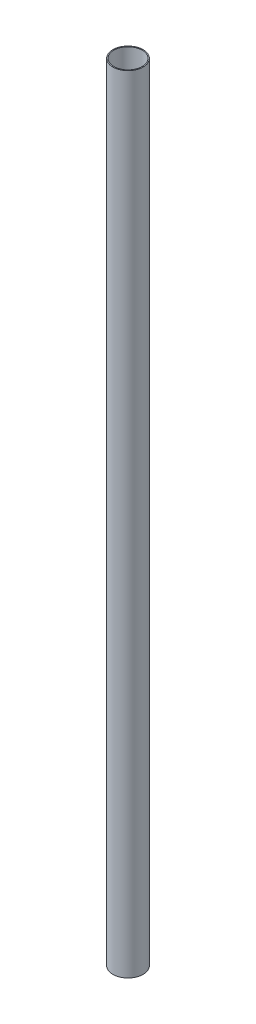
ISO-10303-21;
HEADER;
FILE_DESCRIPTION(('STEP AP214'),'2;1');
FILE_NAME('part.step','',(''),(''),'','','');
FILE_SCHEMA(('AUTOMOTIVE_DESIGN { 1 0 10303 214 1 1 1 1 }'));
ENDSEC;
DATA;
#1=APPLICATION_CONTEXT('core data for automotive mechanical design processes');
#2=APPLICATION_PROTOCOL_DEFINITION('international standard','automotive_design',2000,#1);
#3=PRODUCT_CONTEXT('',#1,'mechanical');
#4=PRODUCT('Part','Part','',(#3));
#5=PRODUCT_RELATED_PRODUCT_CATEGORY('part','',(#4));
#6=PRODUCT_DEFINITION_FORMATION('','',#4);
#7=PRODUCT_DEFINITION_CONTEXT('part definition',#1,'design');
#8=PRODUCT_DEFINITION('design','',#6,#7);
#9=PRODUCT_DEFINITION_SHAPE('','',#8);
#10=(LENGTH_UNIT() NAMED_UNIT(*) SI_UNIT(.MILLI.,.METRE.));
#11=(NAMED_UNIT(*) PLANE_ANGLE_UNIT() SI_UNIT($,.RADIAN.));
#12=(NAMED_UNIT(*) SI_UNIT($,.STERADIAN.) SOLID_ANGLE_UNIT());
#13=UNCERTAINTY_MEASURE_WITH_UNIT(LENGTH_MEASURE(1.E-05),#10,'distance_accuracy_value','');
#14=(GEOMETRIC_REPRESENTATION_CONTEXT(3) GLOBAL_UNCERTAINTY_ASSIGNED_CONTEXT((#13)) GLOBAL_UNIT_ASSIGNED_CONTEXT((#10,
#11,#12)) REPRESENTATION_CONTEXT('',''));
#15=CARTESIAN_POINT('',(0.,0.,0.));
#16=DIRECTION('',(0.,0.,1.));
#17=DIRECTION('',(1.,0.,0.));
#18=AXIS2_PLACEMENT_3D('',#15,#16,#17);
#19=CARTESIAN_POINT('',(0.,1650.,0.));
#20=DIRECTION('',(0.,1.,0.));
#21=DIRECTION('',(0.,0.,1.));
#22=AXIS2_PLACEMENT_3D('',#19,#20,#21);
#23=PLANE('',#22);
#24=CARTESIAN_POINT('',(0.,1650.,0.));
#25=DIRECTION('',(0.,1.,0.));
#26=DIRECTION('',(0.,0.,1.));
#27=AXIS2_PLACEMENT_3D('',#24,#25,#26);
#28=CIRCLE('',#27,31.75);
#29=CARTESIAN_POINT('',(0.,1650.,31.75));
#30=VERTEX_POINT('',#29);
#31=EDGE_CURVE('E10',#30,#30,#28,.T.);
#32=ORIENTED_EDGE('',*,*,#31,.T.);
#33=EDGE_LOOP('',(#32));
#34=FACE_BOUND('',#33,.T.);
#35=CARTESIAN_POINT('',(0.,1650.,0.));
#36=DIRECTION('',(0.,1.,0.));
#37=DIRECTION('',(0.,0.,1.));
#38=AXIS2_PLACEMENT_3D('',#35,#36,#37);
#39=CIRCLE('',#38,29.75);
#40=CARTESIAN_POINT('',(0.,1650.,29.75));
#41=VERTEX_POINT('',#40);
#42=EDGE_CURVE('E50',#41,#41,#39,.T.);
#43=ORIENTED_EDGE('',*,*,#42,.F.);
#44=EDGE_LOOP('',(#43));
#45=FACE_BOUND('',#44,.T.);
#46=ADVANCED_FACE('F37',(#34,#45),#23,.T.);
#47=CARTESIAN_POINT('',(0.,0.,0.));
#48=DIRECTION('',(0.,1.,0.));
#49=DIRECTION('',(0.,0.,1.));
#50=AXIS2_PLACEMENT_3D('',#47,#48,#49);
#51=PLANE('',#50);
#52=CARTESIAN_POINT('',(0.,0.,0.));
#53=DIRECTION('',(0.,1.,0.));
#54=DIRECTION('',(0.,0.,1.));
#55=AXIS2_PLACEMENT_3D('',#52,#53,#54);
#56=CIRCLE('',#55,31.75);
#57=CARTESIAN_POINT('',(0.,0.,31.75));
#58=VERTEX_POINT('',#57);
#59=EDGE_CURVE('E41',#58,#58,#56,.T.);
#60=ORIENTED_EDGE('',*,*,#59,.F.);
#61=EDGE_LOOP('',(#60));
#62=FACE_BOUND('',#61,.T.);
#63=CARTESIAN_POINT('',(0.,0.,0.));
#64=DIRECTION('',(0.,1.,0.));
#65=DIRECTION('',(0.,0.,1.));
#66=AXIS2_PLACEMENT_3D('',#63,#64,#65);
#67=CIRCLE('',#66,29.75);
#68=CARTESIAN_POINT('',(0.,0.,29.75));
#69=VERTEX_POINT('',#68);
#70=EDGE_CURVE('E52',#69,#69,#67,.T.);
#71=ORIENTED_EDGE('',*,*,#70,.T.);
#72=EDGE_LOOP('',(#71));
#73=FACE_BOUND('',#72,.T.);
#74=ADVANCED_FACE('F64',(#62,#73),#51,.F.);
#75=CARTESIAN_POINT('',(0.,1650.,0.));
#76=DIRECTION('',(0.,-1.,0.));
#77=DIRECTION('',(0.,0.,-1.));
#78=AXIS2_PLACEMENT_3D('',#75,#76,#77);
#79=CYLINDRICAL_SURFACE('',#78,31.75);
#80=ORIENTED_EDGE('',*,*,#31,.F.);
#81=EDGE_LOOP('',(#80));
#82=FACE_BOUND('',#81,.T.);
#83=ORIENTED_EDGE('',*,*,#59,.T.);
#84=EDGE_LOOP('',(#83));
#85=FACE_BOUND('',#84,.T.);
#86=ADVANCED_FACE('F39',(#82,#85),#79,.T.);
#87=CARTESIAN_POINT('',(0.,1650.,0.));
#88=DIRECTION('',(0.,-1.,0.));
#89=DIRECTION('',(0.,0.,-1.));
#90=AXIS2_PLACEMENT_3D('',#87,#88,#89);
#91=CYLINDRICAL_SURFACE('',#90,29.75);
#92=ORIENTED_EDGE('',*,*,#42,.T.);
#93=EDGE_LOOP('',(#92));
#94=FACE_BOUND('',#93,.T.);
#95=ORIENTED_EDGE('',*,*,#70,.F.);
#96=EDGE_LOOP('',(#95));
#97=FACE_BOUND('',#96,.T.);
#98=ADVANCED_FACE('F60',(#94,#97),#91,.F.);
#99=CLOSED_SHELL('',(#46,#74,#86,#98));
#100=MANIFOLD_SOLID_BREP('B2',#99);
#101=ADVANCED_BREP_SHAPE_REPRESENTATION('',(#18,#100),#14);
#102=SHAPE_DEFINITION_REPRESENTATION(#9,#101);
ENDSEC;
END-ISO-10303-21;
